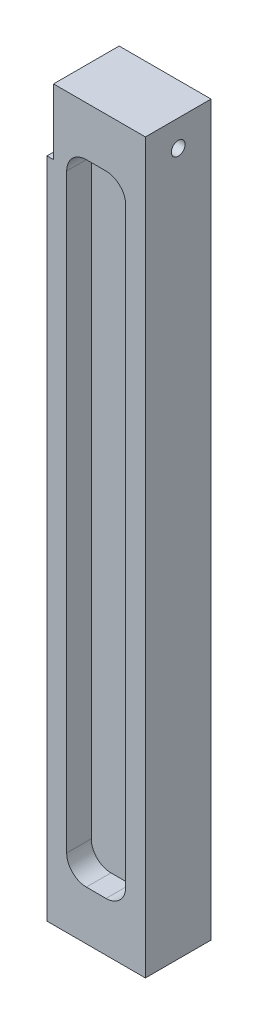
ISO-10303-21;
HEADER;
FILE_DESCRIPTION(('STEP AP214'),'2;1');
FILE_NAME('part.step','',(''),(''),'','','');
FILE_SCHEMA(('AUTOMOTIVE_DESIGN { 1 0 10303 214 1 1 1 1 }'));
ENDSEC;
DATA;
#1=APPLICATION_CONTEXT('core data for automotive mechanical design processes');
#2=APPLICATION_PROTOCOL_DEFINITION('international standard','automotive_design',2000,#1);
#3=PRODUCT_CONTEXT('',#1,'mechanical');
#4=PRODUCT('Part','Part','',(#3));
#5=PRODUCT_RELATED_PRODUCT_CATEGORY('part','',(#4));
#6=PRODUCT_DEFINITION_FORMATION('','',#4);
#7=PRODUCT_DEFINITION_CONTEXT('part definition',#1,'design');
#8=PRODUCT_DEFINITION('design','',#6,#7);
#9=PRODUCT_DEFINITION_SHAPE('','',#8);
#10=(LENGTH_UNIT() NAMED_UNIT(*) SI_UNIT(.MILLI.,.METRE.));
#11=(NAMED_UNIT(*) PLANE_ANGLE_UNIT() SI_UNIT($,.RADIAN.));
#12=(NAMED_UNIT(*) SI_UNIT($,.STERADIAN.) SOLID_ANGLE_UNIT());
#13=UNCERTAINTY_MEASURE_WITH_UNIT(LENGTH_MEASURE(1.E-05),#10,'distance_accuracy_value','');
#14=(GEOMETRIC_REPRESENTATION_CONTEXT(3) GLOBAL_UNCERTAINTY_ASSIGNED_CONTEXT((#13)) GLOBAL_UNIT_ASSIGNED_CONTEXT((#10,
#11,#12)) REPRESENTATION_CONTEXT('',''));
#15=CARTESIAN_POINT('',(0.,0.,0.));
#16=DIRECTION('',(0.,0.,1.));
#17=DIRECTION('',(1.,0.,0.));
#18=AXIS2_PLACEMENT_3D('',#15,#16,#17);
#19=CARTESIAN_POINT('',(-15.,222.,-10.));
#20=DIRECTION('',(0.,0.,1.));
#21=DIRECTION('',(1.,0.,0.));
#22=AXIS2_PLACEMENT_3D('',#19,#20,#21);
#23=PLANE('',#22);
#24=DIRECTION('',(1.,0.,0.));
#25=VECTOR('',#24,1.);
#26=CARTESIAN_POINT('',(-15.,202.,-10.));
#27=LINE('',#26,#25);
#28=CARTESIAN_POINT('',(-15.,202.,-10.));
#29=VERTEX_POINT('',#28);
#30=CARTESIAN_POINT('',(-13.,202.,-10.));
#31=VERTEX_POINT('',#30);
#32=EDGE_CURVE('E225',#29,#31,#27,.T.);
#33=ORIENTED_EDGE('',*,*,#32,.T.);
#34=DIRECTION('',(0.,1.,0.));
#35=VECTOR('',#34,1.);
#36=CARTESIAN_POINT('',(-13.,222.,-10.));
#37=LINE('',#36,#35);
#38=CARTESIAN_POINT('',(-13.,222.,-10.));
#39=VERTEX_POINT('',#38);
#40=EDGE_CURVE('E212',#31,#39,#37,.T.);
#41=ORIENTED_EDGE('',*,*,#40,.T.);
#42=DIRECTION('',(-1.,0.,0.));
#43=VECTOR('',#42,1.);
#44=CARTESIAN_POINT('',(-15.,222.,-10.));
#45=LINE('',#44,#43);
#46=CARTESIAN_POINT('',(15.,222.,-10.));
#47=VERTEX_POINT('',#46);
#48=EDGE_CURVE('E365',#47,#39,#45,.T.);
#49=ORIENTED_EDGE('',*,*,#48,.F.);
#50=DIRECTION('',(0.,-1.,0.));
#51=VECTOR('',#50,1.);
#52=CARTESIAN_POINT('',(15.,222.,-10.));
#53=LINE('',#52,#51);
#54=CARTESIAN_POINT('',(15.,0.,-10.));
#55=VERTEX_POINT('',#54);
#56=EDGE_CURVE('E12',#47,#55,#53,.T.);
#57=ORIENTED_EDGE('',*,*,#56,.T.);
#58=DIRECTION('',(-1.,0.,0.));
#59=VECTOR('',#58,1.);
#60=CARTESIAN_POINT('',(-15.,0.,-10.));
#61=LINE('',#60,#59);
#62=CARTESIAN_POINT('',(-15.,0.,-10.));
#63=VERTEX_POINT('',#62);
#64=EDGE_CURVE('E373',#55,#63,#61,.T.);
#65=ORIENTED_EDGE('',*,*,#64,.T.);
#66=DIRECTION('',(0.,-1.,0.));
#67=VECTOR('',#66,1.);
#68=CARTESIAN_POINT('',(-15.,222.,-10.));
#69=LINE('',#68,#67);
#70=EDGE_CURVE('E52',#29,#63,#69,.T.);
#71=ORIENTED_EDGE('',*,*,#70,.F.);
#72=EDGE_LOOP('',(#33,#41,#49,#57,#65,#71));
#73=FACE_BOUND('',#72,.T.);
#74=CARTESIAN_POINT('',(3.,21.,-10.));
#75=DIRECTION('',(0.,0.,1.));
#76=DIRECTION('',(1.,0.,0.));
#77=AXIS2_PLACEMENT_3D('',#74,#75,#76);
#78=CIRCLE('',#77,6.);
#79=CARTESIAN_POINT('',(3.,15.,-10.));
#80=VERTEX_POINT('',#79);
#81=CARTESIAN_POINT('',(9.,21.,-10.));
#82=VERTEX_POINT('',#81);
#83=EDGE_CURVE('E326',#80,#82,#78,.T.);
#84=ORIENTED_EDGE('',*,*,#83,.T.);
#85=DIRECTION('',(0.,1.,0.));
#86=VECTOR('',#85,1.);
#87=CARTESIAN_POINT('',(9.,21.,-10.));
#88=LINE('',#87,#86);
#89=CARTESIAN_POINT('',(9.,201.,-10.));
#90=VERTEX_POINT('',#89);
#91=EDGE_CURVE('E322',#82,#90,#88,.T.);
#92=ORIENTED_EDGE('',*,*,#91,.T.);
#93=CARTESIAN_POINT('',(3.,201.,-10.));
#94=DIRECTION('',(0.,0.,1.));
#95=DIRECTION('',(-1.,0.,0.));
#96=AXIS2_PLACEMENT_3D('',#93,#94,#95);
#97=CIRCLE('',#96,6.);
#98=CARTESIAN_POINT('',(3.,207.,-10.));
#99=VERTEX_POINT('',#98);
#100=EDGE_CURVE('E318',#90,#99,#97,.T.);
#101=ORIENTED_EDGE('',*,*,#100,.T.);
#102=DIRECTION('',(-1.,0.,0.));
#103=VECTOR('',#102,1.);
#104=CARTESIAN_POINT('',(-3.,207.,-10.));
#105=LINE('',#104,#103);
#106=CARTESIAN_POINT('',(-3.,207.,-10.));
#107=VERTEX_POINT('',#106);
#108=EDGE_CURVE('E314',#99,#107,#105,.T.);
#109=ORIENTED_EDGE('',*,*,#108,.T.);
#110=CARTESIAN_POINT('',(-3.,201.,-10.));
#111=DIRECTION('',(0.,0.,1.));
#112=DIRECTION('',(-1.,0.,0.));
#113=AXIS2_PLACEMENT_3D('',#110,#111,#112);
#114=CIRCLE('',#113,6.);
#115=CARTESIAN_POINT('',(-9.,201.,-10.));
#116=VERTEX_POINT('',#115);
#117=EDGE_CURVE('E310',#107,#116,#114,.T.);
#118=ORIENTED_EDGE('',*,*,#117,.T.);
#119=DIRECTION('',(0.,-1.,0.));
#120=VECTOR('',#119,1.);
#121=CARTESIAN_POINT('',(-9.,21.,-10.));
#122=LINE('',#121,#120);
#123=CARTESIAN_POINT('',(-9.,21.,-10.));
#124=VERTEX_POINT('',#123);
#125=EDGE_CURVE('E306',#116,#124,#122,.T.);
#126=ORIENTED_EDGE('',*,*,#125,.T.);
#127=CARTESIAN_POINT('',(-3.,21.,-10.));
#128=DIRECTION('',(0.,0.,1.));
#129=DIRECTION('',(-1.,0.,0.));
#130=AXIS2_PLACEMENT_3D('',#127,#128,#129);
#131=CIRCLE('',#130,6.);
#132=CARTESIAN_POINT('',(-3.,15.,-10.));
#133=VERTEX_POINT('',#132);
#134=EDGE_CURVE('E302',#124,#133,#131,.T.);
#135=ORIENTED_EDGE('',*,*,#134,.T.);
#136=DIRECTION('',(1.,0.,0.));
#137=VECTOR('',#136,1.);
#138=CARTESIAN_POINT('',(-3.,15.,-10.));
#139=LINE('',#138,#137);
#140=EDGE_CURVE('E297',#133,#80,#139,.T.);
#141=ORIENTED_EDGE('',*,*,#140,.T.);
#142=EDGE_LOOP('',(#84,#92,#101,#109,#118,#126,#135,#141));
#143=FACE_BOUND('',#142,.T.);
#144=ADVANCED_FACE('F43',(#73,#143),#23,.F.);
#145=CARTESIAN_POINT('',(15.,222.,10.));
#146=DIRECTION('',(-1.,0.,0.));
#147=DIRECTION('',(0.,0.,1.));
#148=AXIS2_PLACEMENT_3D('',#145,#146,#147);
#149=PLANE('',#148);
#150=CARTESIAN_POINT('',(15.,214.,0.));
#151=DIRECTION('',(1.,0.,0.));
#152=DIRECTION('',(0.,0.,-1.));
#153=AXIS2_PLACEMENT_3D('',#150,#151,#152);
#154=CIRCLE('',#153,2.09999999999999);
#155=CARTESIAN_POINT('',(15.,214.,-2.09999999999999));
#156=VERTEX_POINT('',#155);
#157=EDGE_CURVE('E227',#156,#156,#154,.T.);
#158=ORIENTED_EDGE('',*,*,#157,.F.);
#159=EDGE_LOOP('',(#158));
#160=FACE_BOUND('',#159,.T.);
#161=DIRECTION('',(0.,0.,-1.));
#162=VECTOR('',#161,1.);
#163=CARTESIAN_POINT('',(15.,0.,10.));
#164=LINE('',#163,#162);
#165=CARTESIAN_POINT('',(15.,0.,10.));
#166=VERTEX_POINT('',#165);
#167=EDGE_CURVE('E332',#166,#55,#164,.T.);
#168=ORIENTED_EDGE('',*,*,#167,.T.);
#169=ORIENTED_EDGE('',*,*,#56,.F.);
#170=DIRECTION('',(0.,0.,-1.));
#171=VECTOR('',#170,1.);
#172=CARTESIAN_POINT('',(15.,222.,10.));
#173=LINE('',#172,#171);
#174=CARTESIAN_POINT('',(15.,222.,10.));
#175=VERTEX_POINT('',#174);
#176=EDGE_CURVE('E362',#175,#47,#173,.T.);
#177=ORIENTED_EDGE('',*,*,#176,.F.);
#178=DIRECTION('',(0.,-1.,0.));
#179=VECTOR('',#178,1.);
#180=CARTESIAN_POINT('',(15.,222.,10.));
#181=LINE('',#180,#179);
#182=EDGE_CURVE('E370',#175,#166,#181,.T.);
#183=ORIENTED_EDGE('',*,*,#182,.T.);
#184=EDGE_LOOP('',(#168,#169,#177,#183));
#185=FACE_BOUND('',#184,.T.);
#186=ADVANCED_FACE('F45',(#160,#185),#149,.F.);
#187=CARTESIAN_POINT('',(-15.,222.,10.));
#188=DIRECTION('',(1.,0.,0.));
#189=DIRECTION('',(0.,0.,-1.));
#190=AXIS2_PLACEMENT_3D('',#187,#188,#189);
#191=PLANE('',#190);
#192=DIRECTION('',(0.,-1.,0.));
#193=VECTOR('',#192,1.);
#194=CARTESIAN_POINT('',(-15.,222.,10.));
#195=LINE('',#194,#193);
#196=CARTESIAN_POINT('',(-15.,202.,10.));
#197=VERTEX_POINT('',#196);
#198=CARTESIAN_POINT('',(-15.,0.,10.));
#199=VERTEX_POINT('',#198);
#200=EDGE_CURVE('E382',#197,#199,#195,.T.);
#201=ORIENTED_EDGE('',*,*,#200,.F.);
#202=DIRECTION('',(0.,0.,-1.));
#203=VECTOR('',#202,1.);
#204=CARTESIAN_POINT('',(-15.,202.,10.));
#205=LINE('',#204,#203);
#206=EDGE_CURVE('E206',#197,#29,#205,.T.);
#207=ORIENTED_EDGE('',*,*,#206,.T.);
#208=ORIENTED_EDGE('',*,*,#70,.T.);
#209=DIRECTION('',(0.,0.,1.));
#210=VECTOR('',#209,1.);
#211=CARTESIAN_POINT('',(-15.,0.,10.));
#212=LINE('',#211,#210);
#213=EDGE_CURVE('E376',#63,#199,#212,.T.);
#214=ORIENTED_EDGE('',*,*,#213,.T.);
#215=EDGE_LOOP('',(#201,#207,#208,#214));
#216=FACE_BOUND('',#215,.T.);
#217=ADVANCED_FACE('F386',(#216),#191,.F.);
#218=CARTESIAN_POINT('',(-15.,222.,10.));
#219=DIRECTION('',(0.,0.,-1.));
#220=DIRECTION('',(-1.,0.,0.));
#221=AXIS2_PLACEMENT_3D('',#218,#219,#220);
#222=PLANE('',#221);
#223=DIRECTION('',(0.,1.,0.));
#224=VECTOR('',#223,1.);
#225=CARTESIAN_POINT('',(9.,21.,10.));
#226=LINE('',#225,#224);
#227=CARTESIAN_POINT('',(9.,21.,10.));
#228=VERTEX_POINT('',#227);
#229=CARTESIAN_POINT('',(9.,201.,10.));
#230=VERTEX_POINT('',#229);
#231=EDGE_CURVE('E277',#228,#230,#226,.T.);
#232=ORIENTED_EDGE('',*,*,#231,.F.);
#233=CARTESIAN_POINT('',(3.,21.,10.));
#234=DIRECTION('',(0.,0.,1.));
#235=DIRECTION('',(1.,0.,0.));
#236=AXIS2_PLACEMENT_3D('',#233,#234,#235);
#237=CIRCLE('',#236,6.);
#238=CARTESIAN_POINT('',(3.,15.,10.));
#239=VERTEX_POINT('',#238);
#240=EDGE_CURVE('E67',#239,#228,#237,.T.);
#241=ORIENTED_EDGE('',*,*,#240,.F.);
#242=DIRECTION('',(1.,0.,0.));
#243=VECTOR('',#242,1.);
#244=CARTESIAN_POINT('',(-3.,15.,10.));
#245=LINE('',#244,#243);
#246=CARTESIAN_POINT('',(-3.,15.,10.));
#247=VERTEX_POINT('',#246);
#248=EDGE_CURVE('E259',#247,#239,#245,.T.);
#249=ORIENTED_EDGE('',*,*,#248,.F.);
#250=CARTESIAN_POINT('',(-3.,21.,10.));
#251=DIRECTION('',(0.,0.,1.));
#252=DIRECTION('',(-1.,0.,0.));
#253=AXIS2_PLACEMENT_3D('',#250,#251,#252);
#254=CIRCLE('',#253,6.);
#255=CARTESIAN_POINT('',(-9.,21.,10.));
#256=VERTEX_POINT('',#255);
#257=EDGE_CURVE('E262',#256,#247,#254,.T.);
#258=ORIENTED_EDGE('',*,*,#257,.F.);
#259=DIRECTION('',(0.,-1.,0.));
#260=VECTOR('',#259,1.);
#261=CARTESIAN_POINT('',(-9.,21.,10.));
#262=LINE('',#261,#260);
#263=CARTESIAN_POINT('',(-9.,201.,10.));
#264=VERTEX_POINT('',#263);
#265=EDGE_CURVE('E265',#264,#256,#262,.T.);
#266=ORIENTED_EDGE('',*,*,#265,.F.);
#267=CARTESIAN_POINT('',(-3.,201.,10.));
#268=DIRECTION('',(0.,0.,1.));
#269=DIRECTION('',(-1.,0.,0.));
#270=AXIS2_PLACEMENT_3D('',#267,#268,#269);
#271=CIRCLE('',#270,6.);
#272=CARTESIAN_POINT('',(-3.,207.,10.));
#273=VERTEX_POINT('',#272);
#274=EDGE_CURVE('E268',#273,#264,#271,.T.);
#275=ORIENTED_EDGE('',*,*,#274,.F.);
#276=DIRECTION('',(-1.,0.,0.));
#277=VECTOR('',#276,1.);
#278=CARTESIAN_POINT('',(-3.,207.,10.));
#279=LINE('',#278,#277);
#280=CARTESIAN_POINT('',(3.,207.,10.));
#281=VERTEX_POINT('',#280);
#282=EDGE_CURVE('E271',#281,#273,#279,.T.);
#283=ORIENTED_EDGE('',*,*,#282,.F.);
#284=CARTESIAN_POINT('',(3.,201.,10.));
#285=DIRECTION('',(0.,0.,1.));
#286=DIRECTION('',(-1.,0.,0.));
#287=AXIS2_PLACEMENT_3D('',#284,#285,#286);
#288=CIRCLE('',#287,6.);
#289=EDGE_CURVE('E274',#230,#281,#288,.T.);
#290=ORIENTED_EDGE('',*,*,#289,.F.);
#291=EDGE_LOOP('',(#232,#241,#249,#258,#266,#275,#283,#290));
#292=FACE_BOUND('',#291,.T.);
#293=DIRECTION('',(1.,0.,0.));
#294=VECTOR('',#293,1.);
#295=CARTESIAN_POINT('',(-15.,222.,10.));
#296=LINE('',#295,#294);
#297=CARTESIAN_POINT('',(-13.,222.,10.));
#298=VERTEX_POINT('',#297);
#299=EDGE_CURVE('E217',#298,#175,#296,.T.);
#300=ORIENTED_EDGE('',*,*,#299,.F.);
#301=DIRECTION('',(0.,-1.,0.));
#302=VECTOR('',#301,1.);
#303=CARTESIAN_POINT('',(-13.,222.,10.));
#304=LINE('',#303,#302);
#305=CARTESIAN_POINT('',(-13.,202.,10.));
#306=VERTEX_POINT('',#305);
#307=EDGE_CURVE('E59',#298,#306,#304,.T.);
#308=ORIENTED_EDGE('',*,*,#307,.T.);
#309=DIRECTION('',(-1.,0.,0.));
#310=VECTOR('',#309,1.);
#311=CARTESIAN_POINT('',(-13.,202.,10.));
#312=LINE('',#311,#310);
#313=EDGE_CURVE('E201',#306,#197,#312,.T.);
#314=ORIENTED_EDGE('',*,*,#313,.T.);
#315=ORIENTED_EDGE('',*,*,#200,.T.);
#316=DIRECTION('',(1.,0.,0.));
#317=VECTOR('',#316,1.);
#318=CARTESIAN_POINT('',(-15.,0.,10.));
#319=LINE('',#318,#317);
#320=EDGE_CURVE('E366',#199,#166,#319,.T.);
#321=ORIENTED_EDGE('',*,*,#320,.T.);
#322=ORIENTED_EDGE('',*,*,#182,.F.);
#323=EDGE_LOOP('',(#300,#308,#314,#315,#321,#322));
#324=FACE_BOUND('',#323,.T.);
#325=ADVANCED_FACE('F215',(#292,#324),#222,.F.);
#326=CARTESIAN_POINT('',(0.,222.,0.));
#327=DIRECTION('',(0.,-1.,0.));
#328=DIRECTION('',(0.,0.,-1.));
#329=AXIS2_PLACEMENT_3D('',#326,#327,#328);
#330=PLANE('',#329);
#331=ORIENTED_EDGE('',*,*,#48,.T.);
#332=DIRECTION('',(0.,0.,-1.));
#333=VECTOR('',#332,1.);
#334=CARTESIAN_POINT('',(-13.,222.,10.));
#335=LINE('',#334,#333);
#336=EDGE_CURVE('E218',#298,#39,#335,.T.);
#337=ORIENTED_EDGE('',*,*,#336,.F.);
#338=ORIENTED_EDGE('',*,*,#299,.T.);
#339=ORIENTED_EDGE('',*,*,#176,.T.);
#340=EDGE_LOOP('',(#331,#337,#338,#339));
#341=FACE_BOUND('',#340,.T.);
#342=ADVANCED_FACE('F398',(#341),#330,.F.);
#343=CARTESIAN_POINT('',(0.,0.,0.));
#344=DIRECTION('',(0.,-1.,0.));
#345=DIRECTION('',(0.,0.,-1.));
#346=AXIS2_PLACEMENT_3D('',#343,#344,#345);
#347=PLANE('',#346);
#348=CARTESIAN_POINT('',(-8.,0.,0.));
#349=DIRECTION('',(0.,-1.,0.));
#350=DIRECTION('',(0.,0.,-1.));
#351=AXIS2_PLACEMENT_3D('',#348,#349,#350);
#352=CIRCLE('',#351,2.09999999999999);
#353=CARTESIAN_POINT('',(-8.,0.,-2.09999999999999));
#354=VERTEX_POINT('',#353);
#355=EDGE_CURVE('E230',#354,#354,#352,.T.);
#356=ORIENTED_EDGE('',*,*,#355,.F.);
#357=EDGE_LOOP('',(#356));
#358=FACE_BOUND('',#357,.T.);
#359=CARTESIAN_POINT('',(8.,0.,0.));
#360=DIRECTION('',(0.,-1.,0.));
#361=DIRECTION('',(0.,0.,-1.));
#362=AXIS2_PLACEMENT_3D('',#359,#360,#361);
#363=CIRCLE('',#362,2.09999999999999);
#364=CARTESIAN_POINT('',(8.,0.,-2.09999999999999));
#365=VERTEX_POINT('',#364);
#366=EDGE_CURVE('E236',#365,#365,#363,.T.);
#367=ORIENTED_EDGE('',*,*,#366,.F.);
#368=EDGE_LOOP('',(#367));
#369=FACE_BOUND('',#368,.T.);
#370=ORIENTED_EDGE('',*,*,#167,.F.);
#371=ORIENTED_EDGE('',*,*,#320,.F.);
#372=ORIENTED_EDGE('',*,*,#213,.F.);
#373=ORIENTED_EDGE('',*,*,#64,.F.);
#374=EDGE_LOOP('',(#370,#371,#372,#373));
#375=FACE_BOUND('',#374,.T.);
#376=ADVANCED_FACE('F394',(#358,#369,#375),#347,.T.);
#377=CARTESIAN_POINT('',(3.,21.,192.841904159858));
#378=DIRECTION('',(0.,0.,-1.));
#379=DIRECTION('',(-1.,0.,0.));
#380=AXIS2_PLACEMENT_3D('',#377,#378,#379);
#381=CYLINDRICAL_SURFACE('',#380,6.);
#382=CARTESIAN_POINT('',(3.,21.,-2.5));
#383=DIRECTION('',(0.,0.,1.));
#384=DIRECTION('',(1.,0.,0.));
#385=AXIS2_PLACEMENT_3D('',#382,#383,#384);
#386=CIRCLE('',#385,6.);
#387=CARTESIAN_POINT('',(3.,15.,-2.5));
#388=VERTEX_POINT('',#387);
#389=CARTESIAN_POINT('',(9.,21.,-2.49999999999995));
#390=VERTEX_POINT('',#389);
#391=EDGE_CURVE('E348',#388,#390,#386,.T.);
#392=ORIENTED_EDGE('',*,*,#391,.T.);
#393=DIRECTION('',(0.,0.,-1.));
#394=VECTOR('',#393,1.);
#395=CARTESIAN_POINT('',(9.,21.,192.841904159858));
#396=LINE('',#395,#394);
#397=EDGE_CURVE('E325',#390,#82,#396,.T.);
#398=ORIENTED_EDGE('',*,*,#397,.T.);
#399=ORIENTED_EDGE('',*,*,#83,.F.);
#400=DIRECTION('',(0.,0.,-1.));
#401=VECTOR('',#400,1.);
#402=CARTESIAN_POINT('',(3.,15.,192.841904159858));
#403=LINE('',#402,#401);
#404=EDGE_CURVE('E296',#388,#80,#403,.T.);
#405=ORIENTED_EDGE('',*,*,#404,.F.);
#406=EDGE_LOOP('',(#392,#398,#399,#405));
#407=FACE_BOUND('',#406,.T.);
#408=ADVANCED_FACE('F405',(#407),#381,.F.);
#409=CARTESIAN_POINT('',(9.,21.,192.841904159858));
#410=DIRECTION('',(-1.,0.,0.));
#411=DIRECTION('',(0.,0.,1.));
#412=AXIS2_PLACEMENT_3D('',#409,#410,#411);
#413=PLANE('',#412);
#414=DIRECTION('',(0.,1.,0.));
#415=VECTOR('',#414,1.);
#416=CARTESIAN_POINT('',(9.,21.,-2.5));
#417=LINE('',#416,#415);
#418=CARTESIAN_POINT('',(9.,201.,-2.49999999999995));
#419=VERTEX_POINT('',#418);
#420=EDGE_CURVE('E345',#390,#419,#417,.T.);
#421=ORIENTED_EDGE('',*,*,#420,.T.);
#422=DIRECTION('',(0.,0.,-1.));
#423=VECTOR('',#422,1.);
#424=CARTESIAN_POINT('',(9.,201.,192.841904159858));
#425=LINE('',#424,#423);
#426=EDGE_CURVE('E321',#419,#90,#425,.T.);
#427=ORIENTED_EDGE('',*,*,#426,.T.);
#428=ORIENTED_EDGE('',*,*,#91,.F.);
#429=ORIENTED_EDGE('',*,*,#397,.F.);
#430=EDGE_LOOP('',(#421,#427,#428,#429));
#431=FACE_BOUND('',#430,.T.);
#432=ADVANCED_FACE('F542',(#431),#413,.T.);
#433=CARTESIAN_POINT('',(3.,201.,192.841904159858));
#434=DIRECTION('',(0.,0.,-1.));
#435=DIRECTION('',(-1.,0.,0.));
#436=AXIS2_PLACEMENT_3D('',#433,#434,#435);
#437=CYLINDRICAL_SURFACE('',#436,6.);
#438=CARTESIAN_POINT('',(3.,201.,-2.5));
#439=DIRECTION('',(0.,0.,1.));
#440=DIRECTION('',(1.,0.,0.));
#441=AXIS2_PLACEMENT_3D('',#438,#439,#440);
#442=CIRCLE('',#441,6.);
#443=CARTESIAN_POINT('',(3.,207.,-2.49999999999995));
#444=VERTEX_POINT('',#443);
#445=EDGE_CURVE('E342',#419,#444,#442,.T.);
#446=ORIENTED_EDGE('',*,*,#445,.T.);
#447=DIRECTION('',(0.,0.,-1.));
#448=VECTOR('',#447,1.);
#449=CARTESIAN_POINT('',(3.,207.,192.841904159858));
#450=LINE('',#449,#448);
#451=EDGE_CURVE('E317',#444,#99,#450,.T.);
#452=ORIENTED_EDGE('',*,*,#451,.T.);
#453=ORIENTED_EDGE('',*,*,#100,.F.);
#454=ORIENTED_EDGE('',*,*,#426,.F.);
#455=EDGE_LOOP('',(#446,#452,#453,#454));
#456=FACE_BOUND('',#455,.T.);
#457=ADVANCED_FACE('F538',(#456),#437,.F.);
#458=CARTESIAN_POINT('',(-3.,207.,192.841904159858));
#459=DIRECTION('',(0.,-1.,0.));
#460=DIRECTION('',(0.,0.,-1.));
#461=AXIS2_PLACEMENT_3D('',#458,#459,#460);
#462=PLANE('',#461);
#463=DIRECTION('',(-1.,0.,0.));
#464=VECTOR('',#463,1.);
#465=CARTESIAN_POINT('',(-3.,207.,-2.5));
#466=LINE('',#465,#464);
#467=CARTESIAN_POINT('',(-3.,207.,-2.49999999999995));
#468=VERTEX_POINT('',#467);
#469=EDGE_CURVE('E339',#444,#468,#466,.T.);
#470=ORIENTED_EDGE('',*,*,#469,.T.);
#471=DIRECTION('',(0.,0.,-1.));
#472=VECTOR('',#471,1.);
#473=CARTESIAN_POINT('',(-3.,207.,192.841904159858));
#474=LINE('',#473,#472);
#475=EDGE_CURVE('E313',#468,#107,#474,.T.);
#476=ORIENTED_EDGE('',*,*,#475,.T.);
#477=ORIENTED_EDGE('',*,*,#108,.F.);
#478=ORIENTED_EDGE('',*,*,#451,.F.);
#479=EDGE_LOOP('',(#470,#476,#477,#478));
#480=FACE_BOUND('',#479,.T.);
#481=ADVANCED_FACE('F534',(#480),#462,.T.);
#482=CARTESIAN_POINT('',(-3.,201.,192.841904159858));
#483=DIRECTION('',(0.,0.,-1.));
#484=DIRECTION('',(-1.,0.,0.));
#485=AXIS2_PLACEMENT_3D('',#482,#483,#484);
#486=CYLINDRICAL_SURFACE('',#485,6.);
#487=CARTESIAN_POINT('',(-3.,201.,-2.5));
#488=DIRECTION('',(0.,0.,1.));
#489=DIRECTION('',(1.,0.,0.));
#490=AXIS2_PLACEMENT_3D('',#487,#488,#489);
#491=CIRCLE('',#490,6.);
#492=CARTESIAN_POINT('',(-9.,201.,-2.49999999999995));
#493=VERTEX_POINT('',#492);
#494=EDGE_CURVE('E336',#468,#493,#491,.T.);
#495=ORIENTED_EDGE('',*,*,#494,.T.);
#496=DIRECTION('',(0.,0.,-1.));
#497=VECTOR('',#496,1.);
#498=CARTESIAN_POINT('',(-9.,201.,192.841904159858));
#499=LINE('',#498,#497);
#500=EDGE_CURVE('E309',#493,#116,#499,.T.);
#501=ORIENTED_EDGE('',*,*,#500,.T.);
#502=ORIENTED_EDGE('',*,*,#117,.F.);
#503=ORIENTED_EDGE('',*,*,#475,.F.);
#504=EDGE_LOOP('',(#495,#501,#502,#503));
#505=FACE_BOUND('',#504,.T.);
#506=ADVANCED_FACE('F530',(#505),#486,.F.);
#507=CARTESIAN_POINT('',(-9.,21.,192.841904159858));
#508=DIRECTION('',(1.,0.,0.));
#509=DIRECTION('',(0.,0.,-1.));
#510=AXIS2_PLACEMENT_3D('',#507,#508,#509);
#511=PLANE('',#510);
#512=DIRECTION('',(0.,-1.,0.));
#513=VECTOR('',#512,1.);
#514=CARTESIAN_POINT('',(-9.,21.,-2.5));
#515=LINE('',#514,#513);
#516=CARTESIAN_POINT('',(-9.,21.,-2.49999999999995));
#517=VERTEX_POINT('',#516);
#518=EDGE_CURVE('E333',#493,#517,#515,.T.);
#519=ORIENTED_EDGE('',*,*,#518,.T.);
#520=DIRECTION('',(0.,0.,-1.));
#521=VECTOR('',#520,1.);
#522=CARTESIAN_POINT('',(-9.,21.,192.841904159858));
#523=LINE('',#522,#521);
#524=EDGE_CURVE('E305',#517,#124,#523,.T.);
#525=ORIENTED_EDGE('',*,*,#524,.T.);
#526=ORIENTED_EDGE('',*,*,#125,.F.);
#527=ORIENTED_EDGE('',*,*,#500,.F.);
#528=EDGE_LOOP('',(#519,#525,#526,#527));
#529=FACE_BOUND('',#528,.T.);
#530=ADVANCED_FACE('F526',(#529),#511,.T.);
#531=CARTESIAN_POINT('',(-3.,21.,192.841904159858));
#532=DIRECTION('',(0.,0.,-1.));
#533=DIRECTION('',(-1.,0.,0.));
#534=AXIS2_PLACEMENT_3D('',#531,#532,#533);
#535=CYLINDRICAL_SURFACE('',#534,6.);
#536=CARTESIAN_POINT('',(-3.,21.,-2.5));
#537=DIRECTION('',(0.,0.,1.));
#538=DIRECTION('',(1.,0.,0.));
#539=AXIS2_PLACEMENT_3D('',#536,#537,#538);
#540=CIRCLE('',#539,6.);
#541=CARTESIAN_POINT('',(-3.,15.,-2.49999999999995));
#542=VERTEX_POINT('',#541);
#543=EDGE_CURVE('E329',#517,#542,#540,.T.);
#544=ORIENTED_EDGE('',*,*,#543,.T.);
#545=DIRECTION('',(0.,0.,-1.));
#546=VECTOR('',#545,1.);
#547=CARTESIAN_POINT('',(-3.,15.,192.841904159858));
#548=LINE('',#547,#546);
#549=EDGE_CURVE('E301',#542,#133,#548,.T.);
#550=ORIENTED_EDGE('',*,*,#549,.T.);
#551=ORIENTED_EDGE('',*,*,#134,.F.);
#552=ORIENTED_EDGE('',*,*,#524,.F.);
#553=EDGE_LOOP('',(#544,#550,#551,#552));
#554=FACE_BOUND('',#553,.T.);
#555=ADVANCED_FACE('F522',(#554),#535,.F.);
#556=CARTESIAN_POINT('',(-3.,15.,192.841904159858));
#557=DIRECTION('',(0.,1.,0.));
#558=DIRECTION('',(0.,0.,1.));
#559=AXIS2_PLACEMENT_3D('',#556,#557,#558);
#560=PLANE('',#559);
#561=DIRECTION('',(1.,0.,0.));
#562=VECTOR('',#561,1.);
#563=CARTESIAN_POINT('',(-3.,15.,-2.5));
#564=LINE('',#563,#562);
#565=EDGE_CURVE('E300',#542,#388,#564,.T.);
#566=ORIENTED_EDGE('',*,*,#565,.T.);
#567=ORIENTED_EDGE('',*,*,#404,.T.);
#568=ORIENTED_EDGE('',*,*,#140,.F.);
#569=ORIENTED_EDGE('',*,*,#549,.F.);
#570=EDGE_LOOP('',(#566,#567,#568,#569));
#571=FACE_BOUND('',#570,.T.);
#572=ADVANCED_FACE('F519',(#571),#560,.T.);
#573=CARTESIAN_POINT('',(0.,0.,-2.5));
#574=DIRECTION('',(0.,0.,1.));
#575=DIRECTION('',(1.,0.,0.));
#576=AXIS2_PLACEMENT_3D('',#573,#574,#575);
#577=PLANE('',#576);
#578=ORIENTED_EDGE('',*,*,#565,.F.);
#579=ORIENTED_EDGE('',*,*,#543,.F.);
#580=ORIENTED_EDGE('',*,*,#518,.F.);
#581=ORIENTED_EDGE('',*,*,#494,.F.);
#582=ORIENTED_EDGE('',*,*,#469,.F.);
#583=ORIENTED_EDGE('',*,*,#445,.F.);
#584=ORIENTED_EDGE('',*,*,#420,.F.);
#585=ORIENTED_EDGE('',*,*,#391,.F.);
#586=EDGE_LOOP('',(#578,#579,#580,#581,#582,#583,#584,#585));
#587=FACE_BOUND('',#586,.T.);
#588=ADVANCED_FACE('F518',(#587),#577,.F.);
#589=CARTESIAN_POINT('',(3.,21.,-192.841904159858));
#590=DIRECTION('',(0.,0.,1.));
#591=DIRECTION('',(1.,0.,0.));
#592=AXIS2_PLACEMENT_3D('',#589,#590,#591);
#593=CYLINDRICAL_SURFACE('',#592,6.);
#594=CARTESIAN_POINT('',(3.,21.,2.5));
#595=DIRECTION('',(0.,0.,1.));
#596=DIRECTION('',(1.,0.,0.));
#597=AXIS2_PLACEMENT_3D('',#594,#595,#596);
#598=CIRCLE('',#597,6.);
#599=CARTESIAN_POINT('',(9.,21.,2.5));
#600=VERTEX_POINT('',#599);
#601=CARTESIAN_POINT('',(3.,15.,2.5));
#602=VERTEX_POINT('',#601);
#603=EDGE_CURVE('E255',#600,#602,#598,.F.);
#604=ORIENTED_EDGE('',*,*,#603,.T.);
#605=DIRECTION('',(0.,0.,1.));
#606=VECTOR('',#605,1.);
#607=CARTESIAN_POINT('',(3.,15.,-192.841904159858));
#608=LINE('',#607,#606);
#609=EDGE_CURVE('E245',#602,#239,#608,.T.);
#610=ORIENTED_EDGE('',*,*,#609,.T.);
#611=ORIENTED_EDGE('',*,*,#240,.T.);
#612=DIRECTION('',(0.,0.,1.));
#613=VECTOR('',#612,1.);
#614=CARTESIAN_POINT('',(9.,21.,-192.841904159858));
#615=LINE('',#614,#613);
#616=EDGE_CURVE('E280',#600,#228,#615,.T.);
#617=ORIENTED_EDGE('',*,*,#616,.F.);
#618=EDGE_LOOP('',(#604,#610,#611,#617));
#619=FACE_BOUND('',#618,.T.);
#620=ADVANCED_FACE('F514',(#619),#593,.F.);
#621=CARTESIAN_POINT('',(-3.,15.,-192.841904159858));
#622=DIRECTION('',(0.,-1.,0.));
#623=DIRECTION('',(0.,0.,-1.));
#624=AXIS2_PLACEMENT_3D('',#621,#622,#623);
#625=PLANE('',#624);
#626=DIRECTION('',(-1.,0.,0.));
#627=VECTOR('',#626,1.);
#628=CARTESIAN_POINT('',(-3.,15.,2.5));
#629=LINE('',#628,#627);
#630=CARTESIAN_POINT('',(-3.,15.,2.5));
#631=VERTEX_POINT('',#630);
#632=EDGE_CURVE('E253',#602,#631,#629,.T.);
#633=ORIENTED_EDGE('',*,*,#632,.T.);
#634=DIRECTION('',(0.,0.,1.));
#635=VECTOR('',#634,1.);
#636=CARTESIAN_POINT('',(-3.,15.,-192.841904159858));
#637=LINE('',#636,#635);
#638=EDGE_CURVE('E292',#631,#247,#637,.T.);
#639=ORIENTED_EDGE('',*,*,#638,.T.);
#640=ORIENTED_EDGE('',*,*,#248,.T.);
#641=ORIENTED_EDGE('',*,*,#609,.F.);
#642=EDGE_LOOP('',(#633,#639,#640,#641));
#643=FACE_BOUND('',#642,.T.);
#644=ADVANCED_FACE('F510',(#643),#625,.F.);
#645=CARTESIAN_POINT('',(-3.,21.,-192.841904159858));
#646=DIRECTION('',(0.,0.,1.));
#647=DIRECTION('',(1.,0.,0.));
#648=AXIS2_PLACEMENT_3D('',#645,#646,#647);
#649=CYLINDRICAL_SURFACE('',#648,6.);
#650=CARTESIAN_POINT('',(-3.,21.,2.5));
#651=DIRECTION('',(0.,0.,1.));
#652=DIRECTION('',(1.,0.,0.));
#653=AXIS2_PLACEMENT_3D('',#650,#651,#652);
#654=CIRCLE('',#653,6.);
#655=CARTESIAN_POINT('',(-9.,21.,2.5));
#656=VERTEX_POINT('',#655);
#657=EDGE_CURVE('E251',#631,#656,#654,.F.);
#658=ORIENTED_EDGE('',*,*,#657,.T.);
#659=DIRECTION('',(0.,0.,1.));
#660=VECTOR('',#659,1.);
#661=CARTESIAN_POINT('',(-9.,21.,-192.841904159858));
#662=LINE('',#661,#660);
#663=EDGE_CURVE('E290',#656,#256,#662,.T.);
#664=ORIENTED_EDGE('',*,*,#663,.T.);
#665=ORIENTED_EDGE('',*,*,#257,.T.);
#666=ORIENTED_EDGE('',*,*,#638,.F.);
#667=EDGE_LOOP('',(#658,#664,#665,#666));
#668=FACE_BOUND('',#667,.T.);
#669=ADVANCED_FACE('F506',(#668),#649,.F.);
#670=CARTESIAN_POINT('',(-9.,21.,-192.841904159858));
#671=DIRECTION('',(-1.,0.,0.));
#672=DIRECTION('',(0.,0.,1.));
#673=AXIS2_PLACEMENT_3D('',#670,#671,#672);
#674=PLANE('',#673);
#675=DIRECTION('',(0.,1.,0.));
#676=VECTOR('',#675,1.);
#677=CARTESIAN_POINT('',(-9.,21.,2.5));
#678=LINE('',#677,#676);
#679=CARTESIAN_POINT('',(-9.,201.,2.5));
#680=VERTEX_POINT('',#679);
#681=EDGE_CURVE('E249',#656,#680,#678,.T.);
#682=ORIENTED_EDGE('',*,*,#681,.T.);
#683=DIRECTION('',(0.,0.,1.));
#684=VECTOR('',#683,1.);
#685=CARTESIAN_POINT('',(-9.,201.,-192.841904159858));
#686=LINE('',#685,#684);
#687=EDGE_CURVE('E288',#680,#264,#686,.T.);
#688=ORIENTED_EDGE('',*,*,#687,.T.);
#689=ORIENTED_EDGE('',*,*,#265,.T.);
#690=ORIENTED_EDGE('',*,*,#663,.F.);
#691=EDGE_LOOP('',(#682,#688,#689,#690));
#692=FACE_BOUND('',#691,.T.);
#693=ADVANCED_FACE('F502',(#692),#674,.F.);
#694=CARTESIAN_POINT('',(-3.,201.,-192.841904159858));
#695=DIRECTION('',(0.,0.,1.));
#696=DIRECTION('',(1.,0.,0.));
#697=AXIS2_PLACEMENT_3D('',#694,#695,#696);
#698=CYLINDRICAL_SURFACE('',#697,6.);
#699=CARTESIAN_POINT('',(-3.,201.,2.5));
#700=DIRECTION('',(0.,0.,1.));
#701=DIRECTION('',(1.,0.,0.));
#702=AXIS2_PLACEMENT_3D('',#699,#700,#701);
#703=CIRCLE('',#702,6.);
#704=CARTESIAN_POINT('',(-3.,207.,2.5));
#705=VERTEX_POINT('',#704);
#706=EDGE_CURVE('E247',#680,#705,#703,.F.);
#707=ORIENTED_EDGE('',*,*,#706,.T.);
#708=DIRECTION('',(0.,0.,1.));
#709=VECTOR('',#708,1.);
#710=CARTESIAN_POINT('',(-3.,207.,-192.841904159858));
#711=LINE('',#710,#709);
#712=EDGE_CURVE('E286',#705,#273,#711,.T.);
#713=ORIENTED_EDGE('',*,*,#712,.T.);
#714=ORIENTED_EDGE('',*,*,#274,.T.);
#715=ORIENTED_EDGE('',*,*,#687,.F.);
#716=EDGE_LOOP('',(#707,#713,#714,#715));
#717=FACE_BOUND('',#716,.T.);
#718=ADVANCED_FACE('F498',(#717),#698,.F.);
#719=CARTESIAN_POINT('',(-3.,207.,-192.841904159858));
#720=DIRECTION('',(0.,1.,0.));
#721=DIRECTION('',(0.,0.,1.));
#722=AXIS2_PLACEMENT_3D('',#719,#720,#721);
#723=PLANE('',#722);
#724=DIRECTION('',(1.,0.,0.));
#725=VECTOR('',#724,1.);
#726=CARTESIAN_POINT('',(-3.,207.,2.5));
#727=LINE('',#726,#725);
#728=CARTESIAN_POINT('',(3.,207.,2.5));
#729=VERTEX_POINT('',#728);
#730=EDGE_CURVE('E244',#705,#729,#727,.T.);
#731=ORIENTED_EDGE('',*,*,#730,.T.);
#732=DIRECTION('',(0.,0.,1.));
#733=VECTOR('',#732,1.);
#734=CARTESIAN_POINT('',(3.,207.,-192.841904159858));
#735=LINE('',#734,#733);
#736=EDGE_CURVE('E284',#729,#281,#735,.T.);
#737=ORIENTED_EDGE('',*,*,#736,.T.);
#738=ORIENTED_EDGE('',*,*,#282,.T.);
#739=ORIENTED_EDGE('',*,*,#712,.F.);
#740=EDGE_LOOP('',(#731,#737,#738,#739));
#741=FACE_BOUND('',#740,.T.);
#742=ADVANCED_FACE('F494',(#741),#723,.F.);
#743=CARTESIAN_POINT('',(3.,201.,-192.841904159858));
#744=DIRECTION('',(0.,0.,1.));
#745=DIRECTION('',(1.,0.,0.));
#746=AXIS2_PLACEMENT_3D('',#743,#744,#745);
#747=CYLINDRICAL_SURFACE('',#746,6.);
#748=CARTESIAN_POINT('',(3.,201.,2.5));
#749=DIRECTION('',(0.,0.,1.));
#750=DIRECTION('',(1.,0.,0.));
#751=AXIS2_PLACEMENT_3D('',#748,#749,#750);
#752=CIRCLE('',#751,6.);
#753=CARTESIAN_POINT('',(9.,201.,2.49999999999995));
#754=VERTEX_POINT('',#753);
#755=EDGE_CURVE('E242',#729,#754,#752,.F.);
#756=ORIENTED_EDGE('',*,*,#755,.T.);
#757=DIRECTION('',(0.,0.,1.));
#758=VECTOR('',#757,1.);
#759=CARTESIAN_POINT('',(9.,201.,-192.841904159858));
#760=LINE('',#759,#758);
#761=EDGE_CURVE('E282',#754,#230,#760,.T.);
#762=ORIENTED_EDGE('',*,*,#761,.T.);
#763=ORIENTED_EDGE('',*,*,#289,.T.);
#764=ORIENTED_EDGE('',*,*,#736,.F.);
#765=EDGE_LOOP('',(#756,#762,#763,#764));
#766=FACE_BOUND('',#765,.T.);
#767=ADVANCED_FACE('F490',(#766),#747,.F.);
#768=CARTESIAN_POINT('',(9.,21.,-192.841904159858));
#769=DIRECTION('',(1.,0.,0.));
#770=DIRECTION('',(0.,0.,-1.));
#771=AXIS2_PLACEMENT_3D('',#768,#769,#770);
#772=PLANE('',#771);
#773=DIRECTION('',(0.,-1.,0.));
#774=VECTOR('',#773,1.);
#775=CARTESIAN_POINT('',(9.,21.,2.5));
#776=LINE('',#775,#774);
#777=EDGE_CURVE('E257',#754,#600,#776,.T.);
#778=ORIENTED_EDGE('',*,*,#777,.T.);
#779=ORIENTED_EDGE('',*,*,#616,.T.);
#780=ORIENTED_EDGE('',*,*,#231,.T.);
#781=ORIENTED_EDGE('',*,*,#761,.F.);
#782=EDGE_LOOP('',(#778,#779,#780,#781));
#783=FACE_BOUND('',#782,.T.);
#784=ADVANCED_FACE('F486',(#783),#772,.F.);
#785=CARTESIAN_POINT('',(0.,0.,2.5));
#786=DIRECTION('',(0.,0.,1.));
#787=DIRECTION('',(1.,0.,0.));
#788=AXIS2_PLACEMENT_3D('',#785,#786,#787);
#789=PLANE('',#788);
#790=ORIENTED_EDGE('',*,*,#603,.F.);
#791=ORIENTED_EDGE('',*,*,#777,.F.);
#792=ORIENTED_EDGE('',*,*,#755,.F.);
#793=ORIENTED_EDGE('',*,*,#730,.F.);
#794=ORIENTED_EDGE('',*,*,#706,.F.);
#795=ORIENTED_EDGE('',*,*,#681,.F.);
#796=ORIENTED_EDGE('',*,*,#657,.F.);
#797=ORIENTED_EDGE('',*,*,#632,.F.);
#798=EDGE_LOOP('',(#790,#791,#792,#793,#794,#795,#796,#797));
#799=FACE_BOUND('',#798,.T.);
#800=ADVANCED_FACE('F482',(#799),#789,.T.);
#801=CARTESIAN_POINT('',(8.,14.,0.));
#802=DIRECTION('',(0.,-1.,0.));
#803=DIRECTION('',(0.,0.,-1.));
#804=AXIS2_PLACEMENT_3D('',#801,#802,#803);
#805=CONICAL_SURFACE('',#804,2.09999999999999,1.02974425867665);
#806=CARTESIAN_POINT('',(7.99999999999999,15.2618072999579,0.));
#807=VERTEX_POINT('',#806);
#808=VERTEX_LOOP('',#807);
#809=FACE_BOUND('',#808,.T.);
#810=CARTESIAN_POINT('',(8.,14.,0.));
#811=DIRECTION('',(0.,-1.,0.));
#812=DIRECTION('',(0.,0.,-1.));
#813=AXIS2_PLACEMENT_3D('',#810,#811,#812);
#814=CIRCLE('',#813,2.09999999999999);
#815=CARTESIAN_POINT('',(8.,14.,-2.09999999999999));
#816=VERTEX_POINT('',#815);
#817=EDGE_CURVE('E239',#816,#816,#814,.T.);
#818=ORIENTED_EDGE('',*,*,#817,.T.);
#819=EDGE_LOOP('',(#818));
#820=FACE_BOUND('',#819,.T.);
#821=ADVANCED_FACE('F478',(#809,#820),#805,.F.);
#822=CARTESIAN_POINT('',(8.,0.,0.));
#823=DIRECTION('',(0.,-1.,0.));
#824=DIRECTION('',(0.,0.,-1.));
#825=AXIS2_PLACEMENT_3D('',#822,#823,#824);
#826=CYLINDRICAL_SURFACE('',#825,2.09999999999999);
#827=ORIENTED_EDGE('',*,*,#817,.F.);
#828=EDGE_LOOP('',(#827));
#829=FACE_BOUND('',#828,.T.);
#830=ORIENTED_EDGE('',*,*,#366,.T.);
#831=EDGE_LOOP('',(#830));
#832=FACE_BOUND('',#831,.T.);
#833=ADVANCED_FACE('F474',(#829,#832),#826,.F.);
#834=CARTESIAN_POINT('',(-8.,14.,0.));
#835=DIRECTION('',(0.,-1.,0.));
#836=DIRECTION('',(0.,0.,-1.));
#837=AXIS2_PLACEMENT_3D('',#834,#835,#836);
#838=CONICAL_SURFACE('',#837,2.09999999999999,1.02974425867665);
#839=CARTESIAN_POINT('',(-8.,15.2618072999579,0.));
#840=VERTEX_POINT('',#839);
#841=VERTEX_LOOP('',#840);
#842=FACE_BOUND('',#841,.T.);
#843=CARTESIAN_POINT('',(-8.,14.,0.));
#844=DIRECTION('',(0.,-1.,0.));
#845=DIRECTION('',(0.,0.,-1.));
#846=AXIS2_PLACEMENT_3D('',#843,#844,#845);
#847=CIRCLE('',#846,2.09999999999999);
#848=CARTESIAN_POINT('',(-8.,14.,-2.09999999999999));
#849=VERTEX_POINT('',#848);
#850=EDGE_CURVE('E233',#849,#849,#847,.T.);
#851=ORIENTED_EDGE('',*,*,#850,.T.);
#852=EDGE_LOOP('',(#851));
#853=FACE_BOUND('',#852,.T.);
#854=ADVANCED_FACE('F470',(#842,#853),#838,.F.);
#855=CARTESIAN_POINT('',(-8.,0.,0.));
#856=DIRECTION('',(0.,-1.,0.));
#857=DIRECTION('',(0.,0.,-1.));
#858=AXIS2_PLACEMENT_3D('',#855,#856,#857);
#859=CYLINDRICAL_SURFACE('',#858,2.09999999999999);
#860=ORIENTED_EDGE('',*,*,#850,.F.);
#861=EDGE_LOOP('',(#860));
#862=FACE_BOUND('',#861,.T.);
#863=ORIENTED_EDGE('',*,*,#355,.T.);
#864=EDGE_LOOP('',(#863));
#865=FACE_BOUND('',#864,.T.);
#866=ADVANCED_FACE('F442',(#862,#865),#859,.F.);
#867=CARTESIAN_POINT('',(15.,214.,0.));
#868=DIRECTION('',(1.,0.,0.));
#869=DIRECTION('',(0.,0.,-1.));
#870=AXIS2_PLACEMENT_3D('',#867,#868,#869);
#871=CYLINDRICAL_SURFACE('',#870,2.09999999999999);
#872=CARTESIAN_POINT('',(-13.,214.,0.));
#873=DIRECTION('',(1.,0.,0.));
#874=DIRECTION('',(0.,1.,0.));
#875=AXIS2_PLACEMENT_3D('',#872,#873,#874);
#876=CIRCLE('',#875,2.09999999999999);
#877=CARTESIAN_POINT('',(-13.,216.1,0.));
#878=VERTEX_POINT('',#877);
#879=EDGE_CURVE('E47',#878,#878,#876,.F.);
#880=ORIENTED_EDGE('',*,*,#879,.T.);
#881=EDGE_LOOP('',(#880));
#882=FACE_BOUND('',#881,.T.);
#883=ORIENTED_EDGE('',*,*,#157,.T.);
#884=EDGE_LOOP('',(#883));
#885=FACE_BOUND('',#884,.T.);
#886=ADVANCED_FACE('F436',(#882,#885),#871,.F.);
#887=CARTESIAN_POINT('',(-13.,202.,10.));
#888=DIRECTION('',(0.,-1.,0.));
#889=DIRECTION('',(0.,0.,-1.));
#890=AXIS2_PLACEMENT_3D('',#887,#888,#889);
#891=PLANE('',#890);
#892=ORIENTED_EDGE('',*,*,#32,.F.);
#893=ORIENTED_EDGE('',*,*,#206,.F.);
#894=ORIENTED_EDGE('',*,*,#313,.F.);
#895=DIRECTION('',(0.,0.,-1.));
#896=VECTOR('',#895,1.);
#897=CARTESIAN_POINT('',(-13.,202.,10.));
#898=LINE('',#897,#896);
#899=EDGE_CURVE('E203',#306,#31,#898,.T.);
#900=ORIENTED_EDGE('',*,*,#899,.T.);
#901=EDGE_LOOP('',(#892,#893,#894,#900));
#902=FACE_BOUND('',#901,.T.);
#903=ADVANCED_FACE('F202',(#902),#891,.F.);
#904=CARTESIAN_POINT('',(-13.,222.,10.));
#905=DIRECTION('',(1.,0.,0.));
#906=DIRECTION('',(0.,1.,0.));
#907=AXIS2_PLACEMENT_3D('',#904,#905,#906);
#908=PLANE('',#907);
#909=ORIENTED_EDGE('',*,*,#879,.F.);
#910=EDGE_LOOP('',(#909));
#911=FACE_BOUND('',#910,.T.);
#912=ORIENTED_EDGE('',*,*,#40,.F.);
#913=ORIENTED_EDGE('',*,*,#899,.F.);
#914=ORIENTED_EDGE('',*,*,#307,.F.);
#915=ORIENTED_EDGE('',*,*,#336,.T.);
#916=EDGE_LOOP('',(#912,#913,#914,#915));
#917=FACE_BOUND('',#916,.T.);
#918=ADVANCED_FACE('F210',(#911,#917),#908,.F.);
#919=CLOSED_SHELL('',(#144,#186,#217,#325,#342,#376,#408,#432,#457,#481,#506,#530,#555,#572,
#588,#620,#644,#669,#693,#718,#742,#767,#784,#800,#821,#833,#854,#866,#886,#903,#918));
#920=MANIFOLD_SOLID_BREP('B2',#919);
#921=ADVANCED_BREP_SHAPE_REPRESENTATION('',(#18,#920),#14);
#922=SHAPE_DEFINITION_REPRESENTATION(#9,#921);
ENDSEC;
END-ISO-10303-21;
